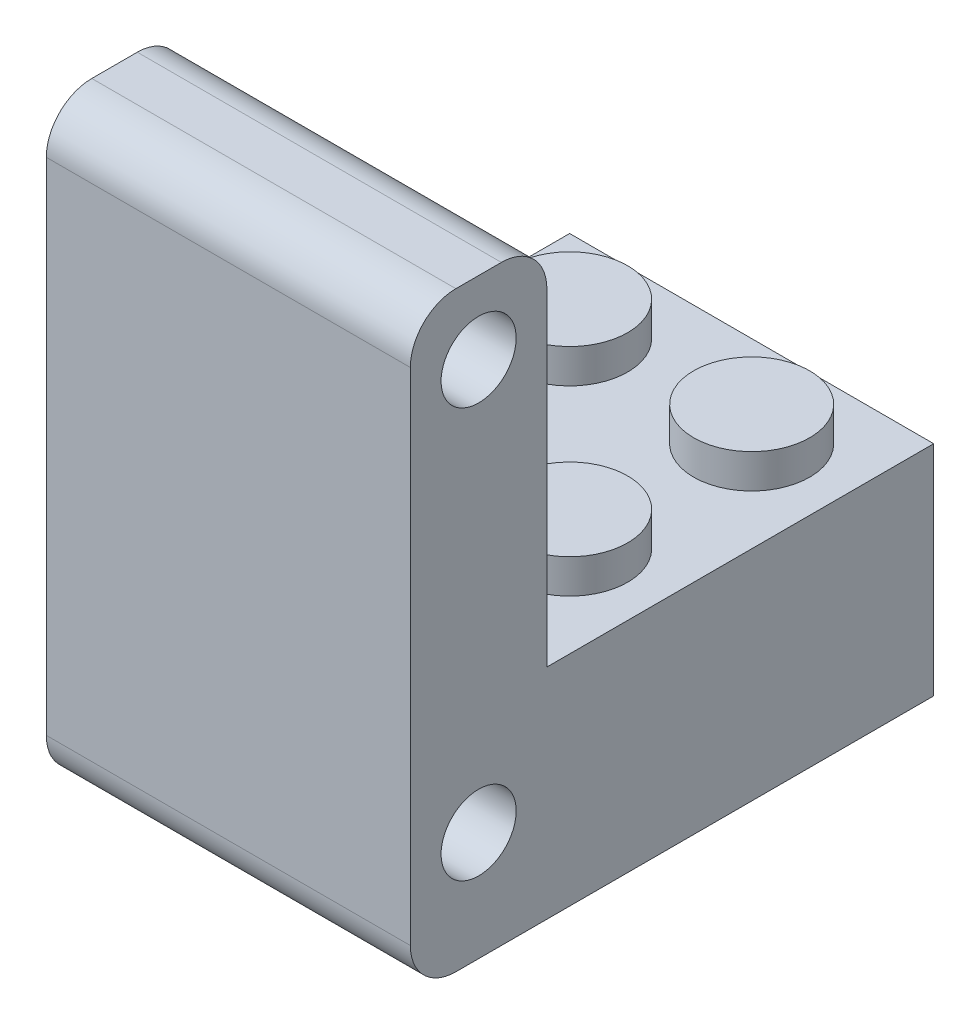
ISO-10303-21;
HEADER;
FILE_DESCRIPTION(('STEP AP214'),'2;1');
FILE_NAME('part.step','',(''),(''),'','','');
FILE_SCHEMA(('AUTOMOTIVE_DESIGN { 1 0 10303 214 1 1 1 1 }'));
ENDSEC;
DATA;
#1=APPLICATION_CONTEXT('core data for automotive mechanical design processes');
#2=APPLICATION_PROTOCOL_DEFINITION('international standard','automotive_design',2000,#1);
#3=PRODUCT_CONTEXT('',#1,'mechanical');
#4=PRODUCT('Part','Part','',(#3));
#5=PRODUCT_RELATED_PRODUCT_CATEGORY('part','',(#4));
#6=PRODUCT_DEFINITION_FORMATION('','',#4);
#7=PRODUCT_DEFINITION_CONTEXT('part definition',#1,'design');
#8=PRODUCT_DEFINITION('design','',#6,#7);
#9=PRODUCT_DEFINITION_SHAPE('','',#8);
#10=(LENGTH_UNIT() NAMED_UNIT(*) SI_UNIT(.MILLI.,.METRE.));
#11=(NAMED_UNIT(*) PLANE_ANGLE_UNIT() SI_UNIT($,.RADIAN.));
#12=(NAMED_UNIT(*) SI_UNIT($,.STERADIAN.) SOLID_ANGLE_UNIT());
#13=UNCERTAINTY_MEASURE_WITH_UNIT(LENGTH_MEASURE(1.E-05),#10,'distance_accuracy_value','');
#14=(GEOMETRIC_REPRESENTATION_CONTEXT(3) GLOBAL_UNCERTAINTY_ASSIGNED_CONTEXT((#13)) GLOBAL_UNIT_ASSIGNED_CONTEXT((#10,
#11,#12)) REPRESENTATION_CONTEXT('',''));
#15=CARTESIAN_POINT('',(0.,0.,0.));
#16=DIRECTION('',(0.,0.,1.));
#17=DIRECTION('',(1.,0.,0.));
#18=AXIS2_PLACEMENT_3D('',#15,#16,#17);
#19=CARTESIAN_POINT('',(59.9999999999999,-19.7967285547747,39.3671413044929));
#20=DIRECTION('',(0.,0.,-1.));
#21=DIRECTION('',(-1.,0.,0.));
#22=AXIS2_PLACEMENT_3D('',#19,#20,#21);
#23=PLANE('',#22);
#24=DIRECTION('',(0.,1.,0.));
#25=VECTOR('',#24,1.);
#26=CARTESIAN_POINT('',(75.9999999999999,-19.7967285547747,39.3671413044929));
#27=LINE('',#26,#25);
#28=CARTESIAN_POINT('',(75.9999999999999,-29.3967285547747,39.3671413044929));
#29=VERTEX_POINT('',#28);
#30=CARTESIAN_POINT('',(75.9999999999999,-19.7967285547747,39.3671413044929));
#31=VERTEX_POINT('',#30);
#32=EDGE_CURVE('E151',#29,#31,#27,.T.);
#33=ORIENTED_EDGE('',*,*,#32,.F.);
#34=DIRECTION('',(1.,0.,0.));
#35=VECTOR('',#34,1.);
#36=CARTESIAN_POINT('',(59.9999999999999,-29.3967285547747,39.3671413044929));
#37=LINE('',#36,#35);
#38=CARTESIAN_POINT('',(59.9999999999999,-29.3967285547747,39.3671413044929));
#39=VERTEX_POINT('',#38);
#40=EDGE_CURVE('E135',#39,#29,#37,.T.);
#41=ORIENTED_EDGE('',*,*,#40,.F.);
#42=DIRECTION('',(0.,1.,0.));
#43=VECTOR('',#42,1.);
#44=CARTESIAN_POINT('',(59.9999999999999,-19.7967285547747,39.3671413044929));
#45=LINE('',#44,#43);
#46=CARTESIAN_POINT('',(59.9999999999999,-19.7967285547747,39.3671413044929));
#47=VERTEX_POINT('',#46);
#48=EDGE_CURVE('E130',#39,#47,#45,.T.);
#49=ORIENTED_EDGE('',*,*,#48,.T.);
#50=DIRECTION('',(1.,0.,0.));
#51=VECTOR('',#50,1.);
#52=CARTESIAN_POINT('',(59.9999999999999,-19.7967285547747,39.3671413044929));
#53=LINE('',#52,#51);
#54=EDGE_CURVE('E114',#47,#31,#53,.T.);
#55=ORIENTED_EDGE('',*,*,#54,.T.);
#56=EDGE_LOOP('',(#33,#41,#49,#55));
#57=FACE_BOUND('',#56,.T.);
#58=ADVANCED_FACE('F41',(#57),#23,.T.);
#59=CARTESIAN_POINT('',(59.9999999999999,-29.3967285547747,39.3671413044929));
#60=DIRECTION('',(0.,-1.,0.));
#61=DIRECTION('',(0.,0.,-1.));
#62=AXIS2_PLACEMENT_3D('',#59,#60,#61);
#63=PLANE('',#62);
#64=DIRECTION('',(0.,0.,-1.));
#65=VECTOR('',#64,1.);
#66=CARTESIAN_POINT('',(75.9999999999999,-29.3967285547747,39.3671413044929));
#67=LINE('',#66,#65);
#68=CARTESIAN_POINT('',(75.9999999999999,-29.3967285547747,60.3671413044929));
#69=VERTEX_POINT('',#68);
#70=EDGE_CURVE('E136',#69,#29,#67,.T.);
#71=ORIENTED_EDGE('',*,*,#70,.F.);
#72=DIRECTION('',(1.,0.,0.));
#73=VECTOR('',#72,1.);
#74=CARTESIAN_POINT('',(59.9999999999999,-29.3967285547747,60.3671413044929));
#75=LINE('',#74,#73);
#76=CARTESIAN_POINT('',(59.9999999999999,-29.3967285547747,60.3671413044929));
#77=VERTEX_POINT('',#76);
#78=EDGE_CURVE('E176',#69,#77,#75,.F.);
#79=ORIENTED_EDGE('',*,*,#78,.T.);
#80=DIRECTION('',(0.,0.,-1.));
#81=VECTOR('',#80,1.);
#82=CARTESIAN_POINT('',(59.9999999999999,-29.3967285547747,39.3671413044929));
#83=LINE('',#82,#81);
#84=EDGE_CURVE('E125',#77,#39,#83,.T.);
#85=ORIENTED_EDGE('',*,*,#84,.T.);
#86=ORIENTED_EDGE('',*,*,#40,.T.);
#87=EDGE_LOOP('',(#71,#79,#85,#86));
#88=FACE_BOUND('',#87,.T.);
#89=ADVANCED_FACE('F201',(#88),#63,.T.);
#90=CARTESIAN_POINT('',(59.9999999999999,-29.3967285547747,62.3671413044929));
#91=DIRECTION('',(0.,0.,1.));
#92=DIRECTION('',(1.,0.,0.));
#93=AXIS2_PLACEMENT_3D('',#90,#91,#92);
#94=PLANE('',#93);
#95=DIRECTION('',(0.,-1.,0.));
#96=VECTOR('',#95,1.);
#97=CARTESIAN_POINT('',(59.9999999999999,-29.3967285547747,62.3671413044929));
#98=LINE('',#97,#96);
#99=CARTESIAN_POINT('',(59.9999999999999,-5.39672855477468,62.3671413044929));
#100=VERTEX_POINT('',#99);
#101=CARTESIAN_POINT('',(59.9999999999999,-27.3967285547747,62.3671413044929));
#102=VERTEX_POINT('',#101);
#103=EDGE_CURVE('E147',#100,#102,#98,.T.);
#104=ORIENTED_EDGE('',*,*,#103,.T.);
#105=DIRECTION('',(1.,0.,0.));
#106=VECTOR('',#105,1.);
#107=CARTESIAN_POINT('',(59.9999999999999,-27.3967285547747,62.3671413044929));
#108=LINE('',#107,#106);
#109=CARTESIAN_POINT('',(75.9999999999999,-27.3967285547747,62.3671413044929));
#110=VERTEX_POINT('',#109);
#111=EDGE_CURVE('E167',#102,#110,#108,.T.);
#112=ORIENTED_EDGE('',*,*,#111,.T.);
#113=DIRECTION('',(0.,-1.,0.));
#114=VECTOR('',#113,1.);
#115=CARTESIAN_POINT('',(75.9999999999999,-29.3967285547747,62.3671413044929));
#116=LINE('',#115,#114);
#117=CARTESIAN_POINT('',(75.9999999999999,-5.39672855477468,62.3671413044929));
#118=VERTEX_POINT('',#117);
#119=EDGE_CURVE('E138',#118,#110,#116,.T.);
#120=ORIENTED_EDGE('',*,*,#119,.F.);
#121=DIRECTION('',(1.,0.,0.));
#122=VECTOR('',#121,1.);
#123=CARTESIAN_POINT('',(59.9999999999999,-5.39672855477467,62.3671413044929));
#124=LINE('',#123,#122);
#125=EDGE_CURVE('E164',#118,#100,#124,.F.);
#126=ORIENTED_EDGE('',*,*,#125,.T.);
#127=EDGE_LOOP('',(#104,#112,#120,#126));
#128=FACE_BOUND('',#127,.T.);
#129=ADVANCED_FACE('F207',(#128),#94,.T.);
#130=CARTESIAN_POINT('',(59.9999999999999,-3.39672855477468,62.3671413044929));
#131=DIRECTION('',(0.,1.,0.));
#132=DIRECTION('',(-1.,0.,0.));
#133=AXIS2_PLACEMENT_3D('',#130,#131,#132);
#134=PLANE('',#133);
#135=DIRECTION('',(0.,0.,1.));
#136=VECTOR('',#135,1.);
#137=CARTESIAN_POINT('',(59.9999999999999,-3.39672855477468,62.3671413044929));
#138=LINE('',#137,#136);
#139=CARTESIAN_POINT('',(59.9999999999999,-3.39672855477468,58.3671413044929));
#140=VERTEX_POINT('',#139);
#141=CARTESIAN_POINT('',(59.9999999999999,-3.39672855477468,60.3671413044929));
#142=VERTEX_POINT('',#141);
#143=EDGE_CURVE('E145',#140,#142,#138,.T.);
#144=ORIENTED_EDGE('',*,*,#143,.T.);
#145=DIRECTION('',(1.,0.,0.));
#146=VECTOR('',#145,1.);
#147=CARTESIAN_POINT('',(59.9999999999999,-3.39672855477468,60.3671413044929));
#148=LINE('',#147,#146);
#149=CARTESIAN_POINT('',(75.9999999999999,-3.39672855477468,60.3671413044929));
#150=VERTEX_POINT('',#149);
#151=EDGE_CURVE('E49',#142,#150,#148,.T.);
#152=ORIENTED_EDGE('',*,*,#151,.T.);
#153=DIRECTION('',(0.,0.,1.));
#154=VECTOR('',#153,1.);
#155=CARTESIAN_POINT('',(75.9999999999999,-3.39672855477468,62.3671413044929));
#156=LINE('',#155,#154);
#157=CARTESIAN_POINT('',(75.9999999999999,-3.39672855477468,58.3671413044929));
#158=VERTEX_POINT('',#157);
#159=EDGE_CURVE('E158',#158,#150,#156,.T.);
#160=ORIENTED_EDGE('',*,*,#159,.F.);
#161=DIRECTION('',(1.,0.,0.));
#162=VECTOR('',#161,1.);
#163=CARTESIAN_POINT('',(59.9999999999999,-3.39672855477468,58.3671413044929));
#164=LINE('',#163,#162);
#165=EDGE_CURVE('E182',#158,#140,#164,.F.);
#166=ORIENTED_EDGE('',*,*,#165,.T.);
#167=EDGE_LOOP('',(#144,#152,#160,#166));
#168=FACE_BOUND('',#167,.T.);
#169=ADVANCED_FACE('F187',(#168),#134,.T.);
#170=CARTESIAN_POINT('',(59.9999999999999,-3.39672855477468,56.3671413044929));
#171=DIRECTION('',(0.,0.,-1.));
#172=DIRECTION('',(-1.,0.,0.));
#173=AXIS2_PLACEMENT_3D('',#170,#171,#172);
#174=PLANE('',#173);
#175=DIRECTION('',(0.,1.,0.));
#176=VECTOR('',#175,1.);
#177=CARTESIAN_POINT('',(59.9999999999999,-3.39672855477468,56.3671413044929));
#178=LINE('',#177,#176);
#179=CARTESIAN_POINT('',(59.9999999999999,-19.7967285547747,56.3671413044929));
#180=VERTEX_POINT('',#179);
#181=CARTESIAN_POINT('',(59.9999999999999,-5.39672855477468,56.3671413044929));
#182=VERTEX_POINT('',#181);
#183=EDGE_CURVE('E131',#180,#182,#178,.T.);
#184=ORIENTED_EDGE('',*,*,#183,.T.);
#185=DIRECTION('',(1.,0.,0.));
#186=VECTOR('',#185,1.);
#187=CARTESIAN_POINT('',(59.9999999999999,-5.39672855477468,56.3671413044929));
#188=LINE('',#187,#186);
#189=CARTESIAN_POINT('',(75.9999999999999,-5.39672855477468,56.3671413044929));
#190=VERTEX_POINT('',#189);
#191=EDGE_CURVE('E11',#182,#190,#188,.T.);
#192=ORIENTED_EDGE('',*,*,#191,.T.);
#193=DIRECTION('',(0.,1.,0.));
#194=VECTOR('',#193,1.);
#195=CARTESIAN_POINT('',(75.9999999999999,-3.39672855477468,56.3671413044929));
#196=LINE('',#195,#194);
#197=CARTESIAN_POINT('',(75.9999999999999,-19.7967285547747,56.3671413044929));
#198=VERTEX_POINT('',#197);
#199=EDGE_CURVE('E155',#198,#190,#196,.T.);
#200=ORIENTED_EDGE('',*,*,#199,.F.);
#201=DIRECTION('',(1.,0.,0.));
#202=VECTOR('',#201,1.);
#203=CARTESIAN_POINT('',(59.9999999999999,-19.7967285547747,56.3671413044929));
#204=LINE('',#203,#202);
#205=EDGE_CURVE('E124',#180,#198,#204,.T.);
#206=ORIENTED_EDGE('',*,*,#205,.F.);
#207=EDGE_LOOP('',(#184,#192,#200,#206));
#208=FACE_BOUND('',#207,.T.);
#209=ADVANCED_FACE('F197',(#208),#174,.T.);
#210=CARTESIAN_POINT('',(59.9999999999999,-19.7967285547747,56.3671413044929));
#211=DIRECTION('',(0.,1.,0.));
#212=DIRECTION('',(-1.,0.,0.));
#213=AXIS2_PLACEMENT_3D('',#210,#211,#212);
#214=PLANE('',#213);
#215=CARTESIAN_POINT('',(71.9999999999999,-19.7967285547747,51.3671413044929));
#216=DIRECTION('',(0.,1.,0.));
#217=DIRECTION('',(0.,0.,1.));
#218=AXIS2_PLACEMENT_3D('',#215,#216,#217);
#219=CIRCLE('',#218,2.54999999999999);
#220=CARTESIAN_POINT('',(71.9999999999999,-19.7967285547747,53.9171413044929));
#221=VERTEX_POINT('',#220);
#222=EDGE_CURVE('E300',#221,#221,#219,.T.);
#223=ORIENTED_EDGE('',*,*,#222,.F.);
#224=EDGE_LOOP('',(#223));
#225=FACE_BOUND('',#224,.T.);
#226=CARTESIAN_POINT('',(71.9999999999999,-19.7967285547747,43.3671413044929));
#227=DIRECTION('',(0.,1.,0.));
#228=DIRECTION('',(0.,0.,1.));
#229=AXIS2_PLACEMENT_3D('',#226,#227,#228);
#230=CIRCLE('',#229,2.54999999999999);
#231=CARTESIAN_POINT('',(71.9999999999999,-19.7967285547747,45.9171413044929));
#232=VERTEX_POINT('',#231);
#233=EDGE_CURVE('E294',#232,#232,#230,.T.);
#234=ORIENTED_EDGE('',*,*,#233,.F.);
#235=EDGE_LOOP('',(#234));
#236=FACE_BOUND('',#235,.T.);
#237=CARTESIAN_POINT('',(63.9999999999999,-19.7967285547747,43.3671413044929));
#238=DIRECTION('',(0.,1.,0.));
#239=DIRECTION('',(0.,0.,1.));
#240=AXIS2_PLACEMENT_3D('',#237,#238,#239);
#241=CIRCLE('',#240,2.54999999999999);
#242=CARTESIAN_POINT('',(63.9999999999999,-19.7967285547747,45.9171413044929));
#243=VERTEX_POINT('',#242);
#244=EDGE_CURVE('E283',#243,#243,#241,.T.);
#245=ORIENTED_EDGE('',*,*,#244,.F.);
#246=EDGE_LOOP('',(#245));
#247=FACE_BOUND('',#246,.T.);
#248=CARTESIAN_POINT('',(63.9999999999999,-19.7967285547747,51.3671413044929));
#249=DIRECTION('',(0.,1.,0.));
#250=DIRECTION('',(0.,0.,1.));
#251=AXIS2_PLACEMENT_3D('',#248,#249,#250);
#252=CIRCLE('',#251,2.54999999999999);
#253=CARTESIAN_POINT('',(63.9999999999999,-19.7967285547747,53.9171413044929));
#254=VERTEX_POINT('',#253);
#255=EDGE_CURVE('E282',#254,#254,#252,.T.);
#256=ORIENTED_EDGE('',*,*,#255,.F.);
#257=EDGE_LOOP('',(#256));
#258=FACE_BOUND('',#257,.T.);
#259=DIRECTION('',(0.,0.,1.));
#260=VECTOR('',#259,1.);
#261=CARTESIAN_POINT('',(75.9999999999999,-19.7967285547747,56.3671413044929));
#262=LINE('',#261,#260);
#263=EDGE_CURVE('E119',#31,#198,#262,.T.);
#264=ORIENTED_EDGE('',*,*,#263,.F.);
#265=ORIENTED_EDGE('',*,*,#54,.F.);
#266=DIRECTION('',(0.,0.,1.));
#267=VECTOR('',#266,1.);
#268=CARTESIAN_POINT('',(59.9999999999999,-19.7967285547747,56.3671413044929));
#269=LINE('',#268,#267);
#270=EDGE_CURVE('E117',#47,#180,#269,.T.);
#271=ORIENTED_EDGE('',*,*,#270,.T.);
#272=ORIENTED_EDGE('',*,*,#205,.T.);
#273=EDGE_LOOP('',(#264,#265,#271,#272));
#274=FACE_BOUND('',#273,.T.);
#275=ADVANCED_FACE('F116',(#225,#236,#247,#258,#274),#214,.T.);
#276=CARTESIAN_POINT('',(59.9999999999999,0.,0.));
#277=DIRECTION('',(-1.,0.,0.));
#278=DIRECTION('',(0.,0.,1.));
#279=AXIS2_PLACEMENT_3D('',#276,#277,#278);
#280=PLANE('',#279);
#281=CARTESIAN_POINT('',(59.9999999999999,-6.59672822999267,59.3671413050929));
#282=DIRECTION('',(1.,0.,0.));
#283=DIRECTION('',(0.,1.,0.));
#284=AXIS2_PLACEMENT_3D('',#281,#282,#283);
#285=CIRCLE('',#284,1.65);
#286=CARTESIAN_POINT('',(59.9999999999999,-4.94672822999267,59.3671413050929));
#287=VERTEX_POINT('',#286);
#288=EDGE_CURVE('E306',#287,#287,#285,.T.);
#289=ORIENTED_EDGE('',*,*,#288,.T.);
#290=EDGE_LOOP('',(#289));
#291=FACE_BOUND('',#290,.T.);
#292=CARTESIAN_POINT('',(59.9999999999999,-24.5967282299927,59.3671413050929));
#293=DIRECTION('',(1.,0.,0.));
#294=DIRECTION('',(0.,1.,0.));
#295=AXIS2_PLACEMENT_3D('',#292,#293,#294);
#296=CIRCLE('',#295,1.65);
#297=CARTESIAN_POINT('',(59.9999999999999,-22.9467282299927,59.3671413050929));
#298=VERTEX_POINT('',#297);
#299=EDGE_CURVE('E153',#298,#298,#296,.T.);
#300=ORIENTED_EDGE('',*,*,#299,.T.);
#301=EDGE_LOOP('',(#300));
#302=FACE_BOUND('',#301,.T.);
#303=ORIENTED_EDGE('',*,*,#84,.F.);
#304=CARTESIAN_POINT('',(59.9999999999999,-27.3967285547747,60.3671413044929));
#305=DIRECTION('',(-1.,0.,0.));
#306=DIRECTION('',(0.,0.,1.));
#307=AXIS2_PLACEMENT_3D('',#304,#305,#306);
#308=CIRCLE('',#307,2.);
#309=EDGE_CURVE('E180',#77,#102,#308,.T.);
#310=ORIENTED_EDGE('',*,*,#309,.T.);
#311=ORIENTED_EDGE('',*,*,#103,.F.);
#312=CARTESIAN_POINT('',(59.9999999999999,-5.39672855477468,60.3671413044929));
#313=DIRECTION('',(-1.,0.,0.));
#314=DIRECTION('',(0.,0.,1.));
#315=AXIS2_PLACEMENT_3D('',#312,#313,#314);
#316=CIRCLE('',#315,2.);
#317=EDGE_CURVE('E62',#100,#142,#316,.T.);
#318=ORIENTED_EDGE('',*,*,#317,.T.);
#319=ORIENTED_EDGE('',*,*,#143,.F.);
#320=CARTESIAN_POINT('',(59.9999999999999,-5.39672855477468,58.3671413044929));
#321=DIRECTION('',(-1.,0.,0.));
#322=DIRECTION('',(0.,0.,1.));
#323=AXIS2_PLACEMENT_3D('',#320,#321,#322);
#324=CIRCLE('',#323,2.);
#325=EDGE_CURVE('E56',#140,#182,#324,.T.);
#326=ORIENTED_EDGE('',*,*,#325,.T.);
#327=ORIENTED_EDGE('',*,*,#183,.F.);
#328=ORIENTED_EDGE('',*,*,#270,.F.);
#329=ORIENTED_EDGE('',*,*,#48,.F.);
#330=EDGE_LOOP('',(#303,#310,#311,#318,#319,#326,#327,#328,#329));
#331=FACE_BOUND('',#330,.T.);
#332=ADVANCED_FACE('F129',(#291,#302,#331),#280,.T.);
#333=CARTESIAN_POINT('',(75.9999999999999,0.,0.));
#334=DIRECTION('',(-1.,0.,0.));
#335=DIRECTION('',(0.,0.,1.));
#336=AXIS2_PLACEMENT_3D('',#333,#334,#335);
#337=PLANE('',#336);
#338=CARTESIAN_POINT('',(75.9999999999999,-6.59672822999267,59.3671413050929));
#339=DIRECTION('',(1.,0.,0.));
#340=DIRECTION('',(0.,1.,0.));
#341=AXIS2_PLACEMENT_3D('',#338,#339,#340);
#342=CIRCLE('',#341,1.65);
#343=CARTESIAN_POINT('',(75.9999999999999,-4.94672822999267,59.3671413050929));
#344=VERTEX_POINT('',#343);
#345=EDGE_CURVE('E304',#344,#344,#342,.T.);
#346=ORIENTED_EDGE('',*,*,#345,.F.);
#347=EDGE_LOOP('',(#346));
#348=FACE_BOUND('',#347,.T.);
#349=CARTESIAN_POINT('',(75.9999999999999,-24.5967282299927,59.3671413050929));
#350=DIRECTION('',(1.,0.,0.));
#351=DIRECTION('',(0.,1.,0.));
#352=AXIS2_PLACEMENT_3D('',#349,#350,#351);
#353=CIRCLE('',#352,1.65);
#354=CARTESIAN_POINT('',(75.9999999999999,-22.9467282299927,59.3671413050929));
#355=VERTEX_POINT('',#354);
#356=EDGE_CURVE('E141',#355,#355,#353,.T.);
#357=ORIENTED_EDGE('',*,*,#356,.F.);
#358=EDGE_LOOP('',(#357));
#359=FACE_BOUND('',#358,.T.);
#360=ORIENTED_EDGE('',*,*,#119,.T.);
#361=CARTESIAN_POINT('',(75.9999999999999,-27.3967285547747,60.3671413044929));
#362=DIRECTION('',(-1.,0.,0.));
#363=DIRECTION('',(0.,0.,1.));
#364=AXIS2_PLACEMENT_3D('',#361,#362,#363);
#365=CIRCLE('',#364,2.);
#366=EDGE_CURVE('E174',#110,#69,#365,.F.);
#367=ORIENTED_EDGE('',*,*,#366,.T.);
#368=ORIENTED_EDGE('',*,*,#70,.T.);
#369=ORIENTED_EDGE('',*,*,#32,.T.);
#370=ORIENTED_EDGE('',*,*,#263,.T.);
#371=ORIENTED_EDGE('',*,*,#199,.T.);
#372=CARTESIAN_POINT('',(75.9999999999999,-5.39672855477468,58.3671413044929));
#373=DIRECTION('',(-1.,0.,0.));
#374=DIRECTION('',(0.,0.,1.));
#375=AXIS2_PLACEMENT_3D('',#372,#373,#374);
#376=CIRCLE('',#375,2.);
#377=EDGE_CURVE('E170',#190,#158,#376,.F.);
#378=ORIENTED_EDGE('',*,*,#377,.T.);
#379=ORIENTED_EDGE('',*,*,#159,.T.);
#380=CARTESIAN_POINT('',(75.9999999999999,-5.39672855477468,60.3671413044929));
#381=DIRECTION('',(-1.,0.,0.));
#382=DIRECTION('',(0.,0.,1.));
#383=AXIS2_PLACEMENT_3D('',#380,#381,#382);
#384=CIRCLE('',#383,2.);
#385=EDGE_CURVE('E172',#150,#118,#384,.F.);
#386=ORIENTED_EDGE('',*,*,#385,.T.);
#387=EDGE_LOOP('',(#360,#367,#368,#369,#370,#371,#378,#379,#386));
#388=FACE_BOUND('',#387,.T.);
#389=ADVANCED_FACE('F191',(#348,#359,#388),#337,.F.);
#390=CARTESIAN_POINT('',(59.9999999999999,-24.5967282299927,59.3671413050929));
#391=DIRECTION('',(1.,0.,0.));
#392=DIRECTION('',(0.,1.,0.));
#393=AXIS2_PLACEMENT_3D('',#390,#391,#392);
#394=CYLINDRICAL_SURFACE('',#393,1.65);
#395=ORIENTED_EDGE('',*,*,#299,.F.);
#396=EDGE_LOOP('',(#395));
#397=FACE_BOUND('',#396,.T.);
#398=ORIENTED_EDGE('',*,*,#356,.T.);
#399=EDGE_LOOP('',(#398));
#400=FACE_BOUND('',#399,.T.);
#401=ADVANCED_FACE('F236',(#397,#400),#394,.F.);
#402=CARTESIAN_POINT('',(59.9999999999999,-6.59672822999267,59.3671413050929));
#403=DIRECTION('',(1.,0.,0.));
#404=DIRECTION('',(0.,1.,0.));
#405=AXIS2_PLACEMENT_3D('',#402,#403,#404);
#406=CYLINDRICAL_SURFACE('',#405,1.65);
#407=ORIENTED_EDGE('',*,*,#288,.F.);
#408=EDGE_LOOP('',(#407));
#409=FACE_BOUND('',#408,.T.);
#410=ORIENTED_EDGE('',*,*,#345,.T.);
#411=EDGE_LOOP('',(#410));
#412=FACE_BOUND('',#411,.T.);
#413=ADVANCED_FACE('F242',(#409,#412),#406,.F.);
#414=CARTESIAN_POINT('',(63.9999999999999,-18.2967285547747,51.3671413044929));
#415=DIRECTION('',(0.,-1.,0.));
#416=DIRECTION('',(1.,0.,0.));
#417=AXIS2_PLACEMENT_3D('',#414,#415,#416);
#418=CYLINDRICAL_SURFACE('',#417,2.54999999999999);
#419=CARTESIAN_POINT('',(63.9999999999999,-18.2967285547747,51.3671413044929));
#420=DIRECTION('',(0.,1.,0.));
#421=DIRECTION('',(0.,0.,1.));
#422=AXIS2_PLACEMENT_3D('',#419,#420,#421);
#423=CIRCLE('',#422,2.54999999999999);
#424=CARTESIAN_POINT('',(63.9999999999999,-18.2967285547747,53.9171413044929));
#425=VERTEX_POINT('',#424);
#426=EDGE_CURVE('E286',#425,#425,#423,.T.);
#427=ORIENTED_EDGE('',*,*,#426,.F.);
#428=EDGE_LOOP('',(#427));
#429=FACE_BOUND('',#428,.T.);
#430=ORIENTED_EDGE('',*,*,#255,.T.);
#431=EDGE_LOOP('',(#430));
#432=FACE_BOUND('',#431,.T.);
#433=ADVANCED_FACE('F246',(#429,#432),#418,.T.);
#434=CARTESIAN_POINT('',(0.,-18.2967285547747,0.));
#435=DIRECTION('',(0.,1.,0.));
#436=DIRECTION('',(0.,0.,1.));
#437=AXIS2_PLACEMENT_3D('',#434,#435,#436);
#438=PLANE('',#437);
#439=ORIENTED_EDGE('',*,*,#426,.T.);
#440=EDGE_LOOP('',(#439));
#441=FACE_BOUND('',#440,.T.);
#442=ADVANCED_FACE('F250',(#441),#438,.T.);
#443=CARTESIAN_POINT('',(63.9999999999999,-18.2967285547747,43.3671413044929));
#444=DIRECTION('',(0.,-1.,0.));
#445=DIRECTION('',(1.,0.,0.));
#446=AXIS2_PLACEMENT_3D('',#443,#444,#445);
#447=CYLINDRICAL_SURFACE('',#446,2.54999999999999);
#448=CARTESIAN_POINT('',(63.9999999999999,-18.2967285547747,43.3671413044929));
#449=DIRECTION('',(0.,1.,0.));
#450=DIRECTION('',(0.,0.,1.));
#451=AXIS2_PLACEMENT_3D('',#448,#449,#450);
#452=CIRCLE('',#451,2.54999999999999);
#453=CARTESIAN_POINT('',(63.9999999999999,-18.2967285547747,45.9171413044929));
#454=VERTEX_POINT('',#453);
#455=EDGE_CURVE('E281',#454,#454,#452,.T.);
#456=ORIENTED_EDGE('',*,*,#455,.F.);
#457=EDGE_LOOP('',(#456));
#458=FACE_BOUND('',#457,.T.);
#459=ORIENTED_EDGE('',*,*,#244,.T.);
#460=EDGE_LOOP('',(#459));
#461=FACE_BOUND('',#460,.T.);
#462=ADVANCED_FACE('F254',(#458,#461),#447,.T.);
#463=CARTESIAN_POINT('',(0.,-18.2967285547747,0.));
#464=DIRECTION('',(0.,1.,0.));
#465=DIRECTION('',(0.,0.,1.));
#466=AXIS2_PLACEMENT_3D('',#463,#464,#465);
#467=PLANE('',#466);
#468=ORIENTED_EDGE('',*,*,#455,.T.);
#469=EDGE_LOOP('',(#468));
#470=FACE_BOUND('',#469,.T.);
#471=ADVANCED_FACE('F267',(#470),#467,.T.);
#472=CARTESIAN_POINT('',(71.9999999999999,-18.2967285547747,43.3671413044929));
#473=DIRECTION('',(0.,-1.,0.));
#474=DIRECTION('',(1.,0.,0.));
#475=AXIS2_PLACEMENT_3D('',#472,#473,#474);
#476=CYLINDRICAL_SURFACE('',#475,2.54999999999999);
#477=CARTESIAN_POINT('',(71.9999999999999,-18.2967285547747,43.3671413044929));
#478=DIRECTION('',(0.,1.,0.));
#479=DIRECTION('',(0.,0.,1.));
#480=AXIS2_PLACEMENT_3D('',#477,#478,#479);
#481=CIRCLE('',#480,2.54999999999999);
#482=CARTESIAN_POINT('',(71.9999999999999,-18.2967285547747,45.9171413044929));
#483=VERTEX_POINT('',#482);
#484=EDGE_CURVE('E289',#483,#483,#481,.T.);
#485=ORIENTED_EDGE('',*,*,#484,.F.);
#486=EDGE_LOOP('',(#485));
#487=FACE_BOUND('',#486,.T.);
#488=ORIENTED_EDGE('',*,*,#233,.T.);
#489=EDGE_LOOP('',(#488));
#490=FACE_BOUND('',#489,.T.);
#491=ADVANCED_FACE('F264',(#487,#490),#476,.T.);
#492=CARTESIAN_POINT('',(0.,-18.2967285547747,0.));
#493=DIRECTION('',(0.,1.,0.));
#494=DIRECTION('',(0.,0.,1.));
#495=AXIS2_PLACEMENT_3D('',#492,#493,#494);
#496=PLANE('',#495);
#497=ORIENTED_EDGE('',*,*,#484,.T.);
#498=EDGE_LOOP('',(#497));
#499=FACE_BOUND('',#498,.T.);
#500=ADVANCED_FACE('F259',(#499),#496,.T.);
#501=CARTESIAN_POINT('',(71.9999999999999,-18.2967285547747,51.3671413044929));
#502=DIRECTION('',(0.,-1.,0.));
#503=DIRECTION('',(1.,0.,0.));
#504=AXIS2_PLACEMENT_3D('',#501,#502,#503);
#505=CYLINDRICAL_SURFACE('',#504,2.54999999999999);
#506=CARTESIAN_POINT('',(71.9999999999999,-18.2967285547747,51.3671413044929));
#507=DIRECTION('',(0.,1.,0.));
#508=DIRECTION('',(0.,0.,1.));
#509=AXIS2_PLACEMENT_3D('',#506,#507,#508);
#510=CIRCLE('',#509,2.54999999999999);
#511=CARTESIAN_POINT('',(71.9999999999999,-18.2967285547747,53.9171413044929));
#512=VERTEX_POINT('',#511);
#513=EDGE_CURVE('E297',#512,#512,#510,.T.);
#514=ORIENTED_EDGE('',*,*,#513,.F.);
#515=EDGE_LOOP('',(#514));
#516=FACE_BOUND('',#515,.T.);
#517=ORIENTED_EDGE('',*,*,#222,.T.);
#518=EDGE_LOOP('',(#517));
#519=FACE_BOUND('',#518,.T.);
#520=ADVANCED_FACE('F256',(#516,#519),#505,.T.);
#521=CARTESIAN_POINT('',(0.,-18.2967285547747,0.));
#522=DIRECTION('',(0.,1.,0.));
#523=DIRECTION('',(0.,0.,1.));
#524=AXIS2_PLACEMENT_3D('',#521,#522,#523);
#525=PLANE('',#524);
#526=ORIENTED_EDGE('',*,*,#513,.T.);
#527=EDGE_LOOP('',(#526));
#528=FACE_BOUND('',#527,.T.);
#529=ADVANCED_FACE('F215',(#528),#525,.T.);
#530=CARTESIAN_POINT('',(59.9999999999999,-27.3967285547747,60.3671413044929));
#531=DIRECTION('',(1.,0.,0.));
#532=DIRECTION('',(0.,1.,0.));
#533=AXIS2_PLACEMENT_3D('',#530,#531,#532);
#534=CYLINDRICAL_SURFACE('',#533,2.);
#535=ORIENTED_EDGE('',*,*,#309,.F.);
#536=ORIENTED_EDGE('',*,*,#78,.F.);
#537=ORIENTED_EDGE('',*,*,#366,.F.);
#538=ORIENTED_EDGE('',*,*,#111,.F.);
#539=EDGE_LOOP('',(#535,#536,#537,#538));
#540=FACE_BOUND('',#539,.T.);
#541=ADVANCED_FACE('F205',(#540),#534,.T.);
#542=CARTESIAN_POINT('',(59.9999999999999,-5.39672855477468,60.3671413044929));
#543=DIRECTION('',(1.,0.,0.));
#544=DIRECTION('',(0.,1.,0.));
#545=AXIS2_PLACEMENT_3D('',#542,#543,#544);
#546=CYLINDRICAL_SURFACE('',#545,2.);
#547=ORIENTED_EDGE('',*,*,#317,.F.);
#548=ORIENTED_EDGE('',*,*,#125,.F.);
#549=ORIENTED_EDGE('',*,*,#385,.F.);
#550=ORIENTED_EDGE('',*,*,#151,.F.);
#551=EDGE_LOOP('',(#547,#548,#549,#550));
#552=FACE_BOUND('',#551,.T.);
#553=ADVANCED_FACE('F209',(#552),#546,.T.);
#554=CARTESIAN_POINT('',(59.9999999999999,-5.39672855477468,58.3671413044929));
#555=DIRECTION('',(1.,0.,0.));
#556=DIRECTION('',(0.,1.,0.));
#557=AXIS2_PLACEMENT_3D('',#554,#555,#556);
#558=CYLINDRICAL_SURFACE('',#557,2.);
#559=ORIENTED_EDGE('',*,*,#325,.F.);
#560=ORIENTED_EDGE('',*,*,#165,.F.);
#561=ORIENTED_EDGE('',*,*,#377,.F.);
#562=ORIENTED_EDGE('',*,*,#191,.F.);
#563=EDGE_LOOP('',(#559,#560,#561,#562));
#564=FACE_BOUND('',#563,.T.);
#565=ADVANCED_FACE('F43',(#564),#558,.T.);
#566=CLOSED_SHELL('',(#58,#89,#129,#169,#209,#275,#332,#389,#401,#413,#433,#442,#462,#471,#491,
#500,#520,#529,#541,#553,#565));
#567=MANIFOLD_SOLID_BREP('B2',#566);
#568=ADVANCED_BREP_SHAPE_REPRESENTATION('',(#18,#567),#14);
#569=SHAPE_DEFINITION_REPRESENTATION(#9,#568);
ENDSEC;
END-ISO-10303-21;
